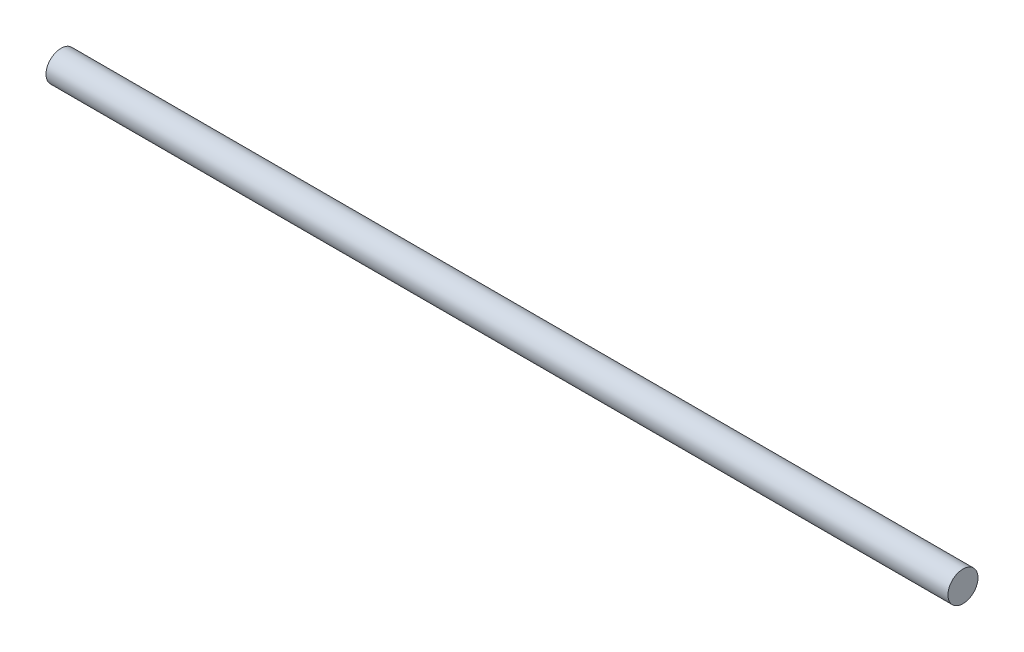
ISO-10303-21;
HEADER;
FILE_DESCRIPTION(('STEP AP214'),'2;1');
FILE_NAME('part.step','',(''),(''),'','','');
FILE_SCHEMA(('AUTOMOTIVE_DESIGN { 1 0 10303 214 1 1 1 1 }'));
ENDSEC;
DATA;
#1=APPLICATION_CONTEXT('core data for automotive mechanical design processes');
#2=APPLICATION_PROTOCOL_DEFINITION('international standard','automotive_design',2000,#1);
#3=PRODUCT_CONTEXT('',#1,'mechanical');
#4=PRODUCT('Part','Part','',(#3));
#5=PRODUCT_RELATED_PRODUCT_CATEGORY('part','',(#4));
#6=PRODUCT_DEFINITION_FORMATION('','',#4);
#7=PRODUCT_DEFINITION_CONTEXT('part definition',#1,'design');
#8=PRODUCT_DEFINITION('design','',#6,#7);
#9=PRODUCT_DEFINITION_SHAPE('','',#8);
#10=(LENGTH_UNIT() NAMED_UNIT(*) SI_UNIT(.MILLI.,.METRE.));
#11=(NAMED_UNIT(*) PLANE_ANGLE_UNIT() SI_UNIT($,.RADIAN.));
#12=(NAMED_UNIT(*) SI_UNIT($,.STERADIAN.) SOLID_ANGLE_UNIT());
#13=UNCERTAINTY_MEASURE_WITH_UNIT(LENGTH_MEASURE(1.E-05),#10,'distance_accuracy_value','');
#14=(GEOMETRIC_REPRESENTATION_CONTEXT(3) GLOBAL_UNCERTAINTY_ASSIGNED_CONTEXT((#13)) GLOBAL_UNIT_ASSIGNED_CONTEXT((#10,
#11,#12)) REPRESENTATION_CONTEXT('',''));
#15=CARTESIAN_POINT('',(0.,0.,0.));
#16=DIRECTION('',(0.,0.,1.));
#17=DIRECTION('',(1.,0.,0.));
#18=AXIS2_PLACEMENT_3D('',#15,#16,#17);
#19=CARTESIAN_POINT('',(-50.,0.,0.));
#20=DIRECTION('',(1.,0.,0.));
#21=DIRECTION('',(0.,0.,-1.));
#22=AXIS2_PLACEMENT_3D('',#19,#20,#21);
#23=PLANE('',#22);
#24=CARTESIAN_POINT('',(-50.,0.,0.));
#25=DIRECTION('',(-1.,0.,0.));
#26=DIRECTION('',(0.,0.,1.));
#27=AXIS2_PLACEMENT_3D('',#24,#25,#26);
#28=CIRCLE('',#27,2.);
#29=CARTESIAN_POINT('',(-50.,0.,2.));
#30=VERTEX_POINT('',#29);
#31=EDGE_CURVE('E10',#30,#30,#28,.T.);
#32=ORIENTED_EDGE('',*,*,#31,.T.);
#33=EDGE_LOOP('',(#32));
#34=FACE_BOUND('',#33,.T.);
#35=ADVANCED_FACE('F45',(#34),#23,.F.);
#36=CARTESIAN_POINT('',(-50.,0.,0.));
#37=DIRECTION('',(-1.,0.,0.));
#38=DIRECTION('',(0.,0.,1.));
#39=AXIS2_PLACEMENT_3D('',#36,#37,#38);
#40=CYLINDRICAL_SURFACE('',#39,2.);
#41=ORIENTED_EDGE('',*,*,#31,.F.);
#42=EDGE_LOOP('',(#41));
#43=FACE_BOUND('',#42,.T.);
#44=CARTESIAN_POINT('',(70.,0.,0.));
#45=DIRECTION('',(1.,0.,0.));
#46=DIRECTION('',(0.,0.,-1.));
#47=AXIS2_PLACEMENT_3D('',#44,#45,#46);
#48=CIRCLE('',#47,2.);
#49=CARTESIAN_POINT('',(70.,0.,-2.));
#50=VERTEX_POINT('',#49);
#51=EDGE_CURVE('E52',#50,#50,#48,.T.);
#52=ORIENTED_EDGE('',*,*,#51,.F.);
#53=EDGE_LOOP('',(#52));
#54=FACE_BOUND('',#53,.T.);
#55=ADVANCED_FACE('F60',(#43,#54),#40,.T.);
#56=CARTESIAN_POINT('',(70.,0.,0.));
#57=DIRECTION('',(1.,0.,0.));
#58=DIRECTION('',(0.,0.,-1.));
#59=AXIS2_PLACEMENT_3D('',#56,#57,#58);
#60=PLANE('',#59);
#61=ORIENTED_EDGE('',*,*,#51,.T.);
#62=EDGE_LOOP('',(#61));
#63=FACE_BOUND('',#62,.T.);
#64=ADVANCED_FACE('F58',(#63),#60,.T.);
#65=CLOSED_SHELL('',(#35,#55,#64));
#66=MANIFOLD_SOLID_BREP('B2',#65);
#67=ADVANCED_BREP_SHAPE_REPRESENTATION('',(#18,#66),#14);
#68=SHAPE_DEFINITION_REPRESENTATION(#9,#67);
ENDSEC;
END-ISO-10303-21;
